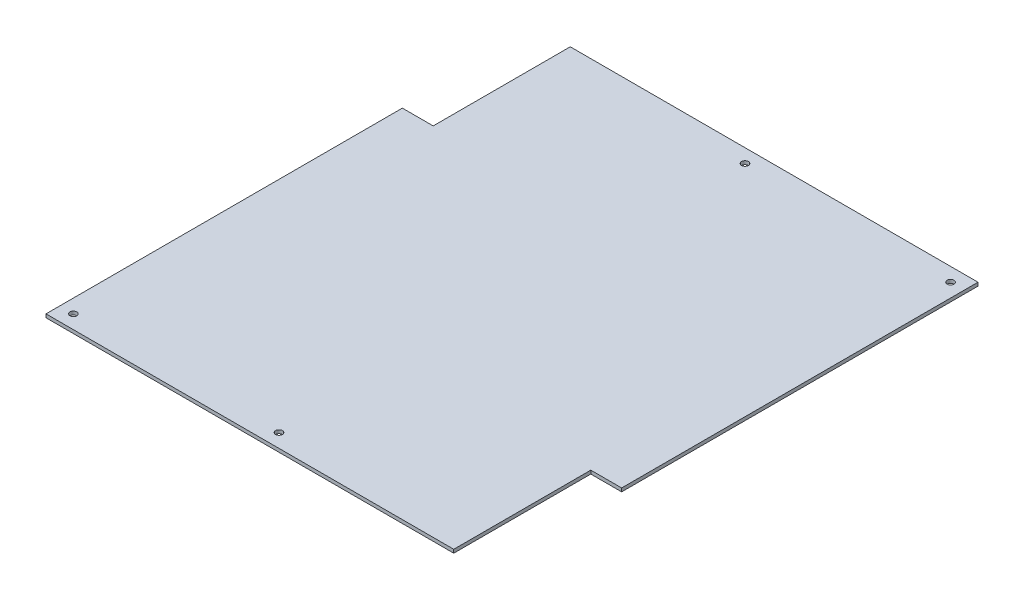
ISO-10303-21;
HEADER;
FILE_DESCRIPTION(('STEP AP214'),'2;1');
FILE_NAME('part.step','',(''),(''),'','','');
FILE_SCHEMA(('AUTOMOTIVE_DESIGN { 1 0 10303 214 1 1 1 1 }'));
ENDSEC;
DATA;
#1=APPLICATION_CONTEXT('core data for automotive mechanical design processes');
#2=APPLICATION_PROTOCOL_DEFINITION('international standard','automotive_design',2000,#1);
#3=PRODUCT_CONTEXT('',#1,'mechanical');
#4=PRODUCT('Part','Part','',(#3));
#5=PRODUCT_RELATED_PRODUCT_CATEGORY('part','',(#4));
#6=PRODUCT_DEFINITION_FORMATION('','',#4);
#7=PRODUCT_DEFINITION_CONTEXT('part definition',#1,'design');
#8=PRODUCT_DEFINITION('design','',#6,#7);
#9=PRODUCT_DEFINITION_SHAPE('','',#8);
#10=(LENGTH_UNIT() NAMED_UNIT(*) SI_UNIT(.MILLI.,.METRE.));
#11=(NAMED_UNIT(*) PLANE_ANGLE_UNIT() SI_UNIT($,.RADIAN.));
#12=(NAMED_UNIT(*) SI_UNIT($,.STERADIAN.) SOLID_ANGLE_UNIT());
#13=UNCERTAINTY_MEASURE_WITH_UNIT(LENGTH_MEASURE(1.E-05),#10,'distance_accuracy_value','');
#14=(GEOMETRIC_REPRESENTATION_CONTEXT(3) GLOBAL_UNCERTAINTY_ASSIGNED_CONTEXT((#13)) GLOBAL_UNIT_ASSIGNED_CONTEXT((#10,
#11,#12)) REPRESENTATION_CONTEXT('',''));
#15=CARTESIAN_POINT('',(0.,0.,0.));
#16=DIRECTION('',(0.,0.,1.));
#17=DIRECTION('',(1.,0.,0.));
#18=AXIS2_PLACEMENT_3D('',#15,#16,#17);
#19=CARTESIAN_POINT('',(-203.2,3.175,228.6));
#20=DIRECTION('',(1.,0.,0.));
#21=DIRECTION('',(0.,0.,-1.));
#22=AXIS2_PLACEMENT_3D('',#19,#20,#21);
#23=PLANE('',#22);
#24=DIRECTION('',(0.,0.,1.));
#25=VECTOR('',#24,1.);
#26=CARTESIAN_POINT('',(-203.2,3.175,228.6));
#27=LINE('',#26,#25);
#28=CARTESIAN_POINT('',(-203.2,3.175,-101.6));
#29=VERTEX_POINT('',#28);
#30=CARTESIAN_POINT('',(-203.2,3.175,228.6));
#31=VERTEX_POINT('',#30);
#32=EDGE_CURVE('E114',#29,#31,#27,.T.);
#33=ORIENTED_EDGE('',*,*,#32,.F.);
#34=DIRECTION('',(0.,1.,0.));
#35=VECTOR('',#34,1.);
#36=CARTESIAN_POINT('',(-203.2,-0.00100000000000013,-101.6));
#37=LINE('',#36,#35);
#38=CARTESIAN_POINT('',(-203.2,0.,-101.6));
#39=VERTEX_POINT('',#38);
#40=EDGE_CURVE('E102',#39,#29,#37,.T.);
#41=ORIENTED_EDGE('',*,*,#40,.F.);
#42=DIRECTION('',(0.,0.,1.));
#43=VECTOR('',#42,1.);
#44=CARTESIAN_POINT('',(-203.2,0.,228.6));
#45=LINE('',#44,#43);
#46=CARTESIAN_POINT('',(-203.2,0.,228.6));
#47=VERTEX_POINT('',#46);
#48=EDGE_CURVE('E107',#39,#47,#45,.T.);
#49=ORIENTED_EDGE('',*,*,#48,.T.);
#50=DIRECTION('',(0.,-1.,0.));
#51=VECTOR('',#50,1.);
#52=CARTESIAN_POINT('',(-203.2,3.175,228.6));
#53=LINE('',#52,#51);
#54=EDGE_CURVE('E11',#31,#47,#53,.T.);
#55=ORIENTED_EDGE('',*,*,#54,.F.);
#56=EDGE_LOOP('',(#33,#41,#49,#55));
#57=FACE_BOUND('',#56,.T.);
#58=ADVANCED_FACE('F35',(#57),#23,.F.);
#59=CARTESIAN_POINT('',(203.2,3.175,228.6));
#60=DIRECTION('',(0.,0.,-1.));
#61=DIRECTION('',(-1.,0.,0.));
#62=AXIS2_PLACEMENT_3D('',#59,#60,#61);
#63=PLANE('',#62);
#64=DIRECTION('',(1.,0.,0.));
#65=VECTOR('',#64,1.);
#66=CARTESIAN_POINT('',(203.2,0.,228.6));
#67=LINE('',#66,#65);
#68=CARTESIAN_POINT('',(174.625,0.,228.6));
#69=VERTEX_POINT('',#68);
#70=EDGE_CURVE('E119',#47,#69,#67,.T.);
#71=ORIENTED_EDGE('',*,*,#70,.T.);
#72=DIRECTION('',(0.,1.,0.));
#73=VECTOR('',#72,1.);
#74=CARTESIAN_POINT('',(174.625,-0.00100000000000013,228.6));
#75=LINE('',#74,#73);
#76=CARTESIAN_POINT('',(174.625,3.175,228.6));
#77=VERTEX_POINT('',#76);
#78=EDGE_CURVE('E148',#69,#77,#75,.T.);
#79=ORIENTED_EDGE('',*,*,#78,.T.);
#80=DIRECTION('',(1.,0.,0.));
#81=VECTOR('',#80,1.);
#82=CARTESIAN_POINT('',(203.2,3.175,228.6));
#83=LINE('',#82,#81);
#84=EDGE_CURVE('E139',#31,#77,#83,.T.);
#85=ORIENTED_EDGE('',*,*,#84,.F.);
#86=ORIENTED_EDGE('',*,*,#54,.T.);
#87=EDGE_LOOP('',(#71,#79,#85,#86));
#88=FACE_BOUND('',#87,.T.);
#89=ADVANCED_FACE('F217',(#88),#63,.F.);
#90=CARTESIAN_POINT('',(203.2,3.175,228.6));
#91=DIRECTION('',(-1.,0.,0.));
#92=DIRECTION('',(0.,0.,1.));
#93=AXIS2_PLACEMENT_3D('',#90,#91,#92);
#94=PLANE('',#93);
#95=DIRECTION('',(0.,0.,-1.));
#96=VECTOR('',#95,1.);
#97=CARTESIAN_POINT('',(203.2,3.175,228.6));
#98=LINE('',#97,#96);
#99=CARTESIAN_POINT('',(203.2,3.175,101.6));
#100=VERTEX_POINT('',#99);
#101=CARTESIAN_POINT('',(203.2,3.175,-228.6));
#102=VERTEX_POINT('',#101);
#103=EDGE_CURVE('E136',#100,#102,#98,.T.);
#104=ORIENTED_EDGE('',*,*,#103,.F.);
#105=DIRECTION('',(0.,1.,0.));
#106=VECTOR('',#105,1.);
#107=CARTESIAN_POINT('',(203.2,-0.00100000000000013,101.6));
#108=LINE('',#107,#106);
#109=CARTESIAN_POINT('',(203.2,0.,101.6));
#110=VERTEX_POINT('',#109);
#111=EDGE_CURVE('E149',#110,#100,#108,.T.);
#112=ORIENTED_EDGE('',*,*,#111,.F.);
#113=DIRECTION('',(0.,0.,-1.));
#114=VECTOR('',#113,1.);
#115=CARTESIAN_POINT('',(203.2,0.,228.6));
#116=LINE('',#115,#114);
#117=CARTESIAN_POINT('',(203.2,0.,-228.6));
#118=VERTEX_POINT('',#117);
#119=EDGE_CURVE('E121',#110,#118,#116,.T.);
#120=ORIENTED_EDGE('',*,*,#119,.T.);
#121=DIRECTION('',(0.,-1.,0.));
#122=VECTOR('',#121,1.);
#123=CARTESIAN_POINT('',(203.2,3.175,-228.6));
#124=LINE('',#123,#122);
#125=EDGE_CURVE('E42',#102,#118,#124,.T.);
#126=ORIENTED_EDGE('',*,*,#125,.F.);
#127=EDGE_LOOP('',(#104,#112,#120,#126));
#128=FACE_BOUND('',#127,.T.);
#129=ADVANCED_FACE('F210',(#128),#94,.F.);
#130=CARTESIAN_POINT('',(203.2,3.175,-228.6));
#131=DIRECTION('',(0.,0.,1.));
#132=DIRECTION('',(1.,0.,0.));
#133=AXIS2_PLACEMENT_3D('',#130,#131,#132);
#134=PLANE('',#133);
#135=DIRECTION('',(-1.,0.,0.));
#136=VECTOR('',#135,1.);
#137=CARTESIAN_POINT('',(203.2,0.,-228.6));
#138=LINE('',#137,#136);
#139=CARTESIAN_POINT('',(-174.625,0.,-228.6));
#140=VERTEX_POINT('',#139);
#141=EDGE_CURVE('E128',#118,#140,#138,.T.);
#142=ORIENTED_EDGE('',*,*,#141,.T.);
#143=DIRECTION('',(0.,1.,0.));
#144=VECTOR('',#143,1.);
#145=CARTESIAN_POINT('',(-174.625,-0.00100000000000013,-228.6));
#146=LINE('',#145,#144);
#147=CARTESIAN_POINT('',(-174.625,3.175,-228.6));
#148=VERTEX_POINT('',#147);
#149=EDGE_CURVE('E108',#140,#148,#146,.T.);
#150=ORIENTED_EDGE('',*,*,#149,.T.);
#151=DIRECTION('',(-1.,0.,0.));
#152=VECTOR('',#151,1.);
#153=CARTESIAN_POINT('',(203.2,3.175,-228.6));
#154=LINE('',#153,#152);
#155=EDGE_CURVE('E124',#102,#148,#154,.T.);
#156=ORIENTED_EDGE('',*,*,#155,.F.);
#157=ORIENTED_EDGE('',*,*,#125,.T.);
#158=EDGE_LOOP('',(#142,#150,#156,#157));
#159=FACE_BOUND('',#158,.T.);
#160=ADVANCED_FACE('F198',(#159),#134,.F.);
#161=CARTESIAN_POINT('',(0.,3.175,0.));
#162=DIRECTION('',(0.,1.,0.));
#163=DIRECTION('',(0.,0.,1.));
#164=AXIS2_PLACEMENT_3D('',#161,#162,#163);
#165=PLANE('',#164);
#166=CARTESIAN_POINT('',(-190.5,3.175,215.9));
#167=DIRECTION('',(0.,1.,0.));
#168=DIRECTION('',(0.,0.,1.));
#169=AXIS2_PLACEMENT_3D('',#166,#167,#168);
#170=CIRCLE('',#169,3.17500000000001);
#171=CARTESIAN_POINT('',(-190.5,3.175,219.075));
#172=VERTEX_POINT('',#171);
#173=EDGE_CURVE('E189',#172,#172,#170,.T.);
#174=ORIENTED_EDGE('',*,*,#173,.F.);
#175=EDGE_LOOP('',(#174));
#176=FACE_BOUND('',#175,.T.);
#177=CARTESIAN_POINT('',(190.5,3.175,-215.9));
#178=DIRECTION('',(0.,1.,0.));
#179=DIRECTION('',(0.,0.,1.));
#180=AXIS2_PLACEMENT_3D('',#177,#178,#179);
#181=CIRCLE('',#180,3.17500000000001);
#182=CARTESIAN_POINT('',(190.5,3.175,-212.725));
#183=VERTEX_POINT('',#182);
#184=EDGE_CURVE('E183',#183,#183,#181,.T.);
#185=ORIENTED_EDGE('',*,*,#184,.F.);
#186=EDGE_LOOP('',(#185));
#187=FACE_BOUND('',#186,.T.);
#188=CARTESIAN_POINT('',(0.,3.175,-215.9));
#189=DIRECTION('',(0.,1.,0.));
#190=DIRECTION('',(0.,0.,1.));
#191=AXIS2_PLACEMENT_3D('',#188,#189,#190);
#192=CIRCLE('',#191,3.175);
#193=CARTESIAN_POINT('',(0.,3.175,-212.725));
#194=VERTEX_POINT('',#193);
#195=EDGE_CURVE('E177',#194,#194,#192,.T.);
#196=ORIENTED_EDGE('',*,*,#195,.F.);
#197=EDGE_LOOP('',(#196));
#198=FACE_BOUND('',#197,.T.);
#199=CARTESIAN_POINT('',(0.,3.175,215.9));
#200=DIRECTION('',(0.,1.,0.));
#201=DIRECTION('',(0.,0.,1.));
#202=AXIS2_PLACEMENT_3D('',#199,#200,#201);
#203=CIRCLE('',#202,3.175);
#204=CARTESIAN_POINT('',(0.,3.175,219.075));
#205=VERTEX_POINT('',#204);
#206=EDGE_CURVE('E171',#205,#205,#203,.T.);
#207=ORIENTED_EDGE('',*,*,#206,.F.);
#208=EDGE_LOOP('',(#207));
#209=FACE_BOUND('',#208,.T.);
#210=DIRECTION('',(0.,0.,-1.));
#211=VECTOR('',#210,1.);
#212=CARTESIAN_POINT('',(-174.625,3.175,-228.6));
#213=LINE('',#212,#211);
#214=CARTESIAN_POINT('',(-174.625,3.175,-101.6));
#215=VERTEX_POINT('',#214);
#216=EDGE_CURVE('E115',#215,#148,#213,.T.);
#217=ORIENTED_EDGE('',*,*,#216,.F.);
#218=DIRECTION('',(1.,0.,0.));
#219=VECTOR('',#218,1.);
#220=CARTESIAN_POINT('',(-203.2,3.175,-101.6));
#221=LINE('',#220,#219);
#222=EDGE_CURVE('E166',#29,#215,#221,.T.);
#223=ORIENTED_EDGE('',*,*,#222,.F.);
#224=ORIENTED_EDGE('',*,*,#32,.T.);
#225=ORIENTED_EDGE('',*,*,#84,.T.);
#226=DIRECTION('',(0.,0.,1.));
#227=VECTOR('',#226,1.);
#228=CARTESIAN_POINT('',(174.625,3.175,228.6));
#229=LINE('',#228,#227);
#230=CARTESIAN_POINT('',(174.625,3.175,101.6));
#231=VERTEX_POINT('',#230);
#232=EDGE_CURVE('E152',#231,#77,#229,.T.);
#233=ORIENTED_EDGE('',*,*,#232,.F.);
#234=DIRECTION('',(-1.,0.,0.));
#235=VECTOR('',#234,1.);
#236=CARTESIAN_POINT('',(203.2,3.175,101.6));
#237=LINE('',#236,#235);
#238=EDGE_CURVE('E157',#100,#231,#237,.T.);
#239=ORIENTED_EDGE('',*,*,#238,.F.);
#240=ORIENTED_EDGE('',*,*,#103,.T.);
#241=ORIENTED_EDGE('',*,*,#155,.T.);
#242=EDGE_LOOP('',(#217,#223,#224,#225,#233,#239,#240,#241));
#243=FACE_BOUND('',#242,.T.);
#244=ADVANCED_FACE('F195',(#176,#187,#198,#209,#243),#165,.T.);
#245=CARTESIAN_POINT('',(0.,0.,0.));
#246=DIRECTION('',(0.,1.,0.));
#247=DIRECTION('',(0.,0.,1.));
#248=AXIS2_PLACEMENT_3D('',#245,#246,#247);
#249=PLANE('',#248);
#250=CARTESIAN_POINT('',(-190.5,0.,215.9));
#251=DIRECTION('',(0.,1.,0.));
#252=DIRECTION('',(0.,0.,1.));
#253=AXIS2_PLACEMENT_3D('',#250,#251,#252);
#254=CIRCLE('',#253,3.17500000000001);
#255=CARTESIAN_POINT('',(-190.5,0.,219.075));
#256=VERTEX_POINT('',#255);
#257=EDGE_CURVE('E186',#256,#256,#254,.T.);
#258=ORIENTED_EDGE('',*,*,#257,.T.);
#259=EDGE_LOOP('',(#258));
#260=FACE_BOUND('',#259,.T.);
#261=CARTESIAN_POINT('',(190.5,0.,-215.9));
#262=DIRECTION('',(0.,1.,0.));
#263=DIRECTION('',(0.,0.,1.));
#264=AXIS2_PLACEMENT_3D('',#261,#262,#263);
#265=CIRCLE('',#264,3.17500000000001);
#266=CARTESIAN_POINT('',(190.5,0.,-212.725));
#267=VERTEX_POINT('',#266);
#268=EDGE_CURVE('E180',#267,#267,#265,.T.);
#269=ORIENTED_EDGE('',*,*,#268,.T.);
#270=EDGE_LOOP('',(#269));
#271=FACE_BOUND('',#270,.T.);
#272=CARTESIAN_POINT('',(0.,0.,-215.9));
#273=DIRECTION('',(0.,1.,0.));
#274=DIRECTION('',(0.,0.,1.));
#275=AXIS2_PLACEMENT_3D('',#272,#273,#274);
#276=CIRCLE('',#275,3.175);
#277=CARTESIAN_POINT('',(0.,0.,-212.725));
#278=VERTEX_POINT('',#277);
#279=EDGE_CURVE('E174',#278,#278,#276,.T.);
#280=ORIENTED_EDGE('',*,*,#279,.T.);
#281=EDGE_LOOP('',(#280));
#282=FACE_BOUND('',#281,.T.);
#283=CARTESIAN_POINT('',(0.,0.,215.9));
#284=DIRECTION('',(0.,1.,0.));
#285=DIRECTION('',(0.,0.,1.));
#286=AXIS2_PLACEMENT_3D('',#283,#284,#285);
#287=CIRCLE('',#286,3.175);
#288=CARTESIAN_POINT('',(0.,0.,219.075));
#289=VERTEX_POINT('',#288);
#290=EDGE_CURVE('E160',#289,#289,#287,.T.);
#291=ORIENTED_EDGE('',*,*,#290,.T.);
#292=EDGE_LOOP('',(#291));
#293=FACE_BOUND('',#292,.T.);
#294=DIRECTION('',(-1.,0.,0.));
#295=VECTOR('',#294,1.);
#296=CARTESIAN_POINT('',(-203.2,0.,-101.6));
#297=LINE('',#296,#295);
#298=CARTESIAN_POINT('',(-174.625,0.,-101.6));
#299=VERTEX_POINT('',#298);
#300=EDGE_CURVE('E98',#299,#39,#297,.T.);
#301=ORIENTED_EDGE('',*,*,#300,.F.);
#302=DIRECTION('',(0.,0.,1.));
#303=VECTOR('',#302,1.);
#304=CARTESIAN_POINT('',(-174.625,0.,-228.6));
#305=LINE('',#304,#303);
#306=EDGE_CURVE('E49',#140,#299,#305,.T.);
#307=ORIENTED_EDGE('',*,*,#306,.F.);
#308=ORIENTED_EDGE('',*,*,#141,.F.);
#309=ORIENTED_EDGE('',*,*,#119,.F.);
#310=DIRECTION('',(1.,0.,0.));
#311=VECTOR('',#310,1.);
#312=CARTESIAN_POINT('',(203.2,0.,101.6));
#313=LINE('',#312,#311);
#314=CARTESIAN_POINT('',(174.625,0.,101.6));
#315=VERTEX_POINT('',#314);
#316=EDGE_CURVE('E146',#315,#110,#313,.T.);
#317=ORIENTED_EDGE('',*,*,#316,.F.);
#318=DIRECTION('',(0.,0.,-1.));
#319=VECTOR('',#318,1.);
#320=CARTESIAN_POINT('',(174.625,0.,228.6));
#321=LINE('',#320,#319);
#322=EDGE_CURVE('E57',#69,#315,#321,.T.);
#323=ORIENTED_EDGE('',*,*,#322,.F.);
#324=ORIENTED_EDGE('',*,*,#70,.F.);
#325=ORIENTED_EDGE('',*,*,#48,.F.);
#326=EDGE_LOOP('',(#301,#307,#308,#309,#317,#323,#324,#325));
#327=FACE_BOUND('',#326,.T.);
#328=ADVANCED_FACE('F117',(#260,#271,#282,#293,#327),#249,.F.);
#329=CARTESIAN_POINT('',(174.625,-0.00100000000000013,228.6));
#330=DIRECTION('',(-1.,0.,0.));
#331=DIRECTION('',(0.,0.,1.));
#332=AXIS2_PLACEMENT_3D('',#329,#330,#331);
#333=PLANE('',#332);
#334=ORIENTED_EDGE('',*,*,#322,.T.);
#335=DIRECTION('',(0.,1.,0.));
#336=VECTOR('',#335,1.);
#337=CARTESIAN_POINT('',(174.625,-0.00100000000000013,101.6));
#338=LINE('',#337,#336);
#339=EDGE_CURVE('E151',#315,#231,#338,.T.);
#340=ORIENTED_EDGE('',*,*,#339,.T.);
#341=ORIENTED_EDGE('',*,*,#232,.T.);
#342=ORIENTED_EDGE('',*,*,#78,.F.);
#343=EDGE_LOOP('',(#334,#340,#341,#342));
#344=FACE_BOUND('',#343,.T.);
#345=ADVANCED_FACE('F215',(#344),#333,.F.);
#346=CARTESIAN_POINT('',(203.2,-0.00100000000000013,101.6));
#347=DIRECTION('',(0.,0.,-1.));
#348=DIRECTION('',(-1.,0.,0.));
#349=AXIS2_PLACEMENT_3D('',#346,#347,#348);
#350=PLANE('',#349);
#351=ORIENTED_EDGE('',*,*,#316,.T.);
#352=ORIENTED_EDGE('',*,*,#111,.T.);
#353=ORIENTED_EDGE('',*,*,#238,.T.);
#354=ORIENTED_EDGE('',*,*,#339,.F.);
#355=EDGE_LOOP('',(#351,#352,#353,#354));
#356=FACE_BOUND('',#355,.T.);
#357=ADVANCED_FACE('F212',(#356),#350,.F.);
#358=CARTESIAN_POINT('',(-174.625,-0.00100000000000013,-228.6));
#359=DIRECTION('',(1.,0.,0.));
#360=DIRECTION('',(0.,0.,-1.));
#361=AXIS2_PLACEMENT_3D('',#358,#359,#360);
#362=PLANE('',#361);
#363=ORIENTED_EDGE('',*,*,#306,.T.);
#364=DIRECTION('',(0.,1.,0.));
#365=VECTOR('',#364,1.);
#366=CARTESIAN_POINT('',(-174.625,-0.00100000000000013,-101.6));
#367=LINE('',#366,#365);
#368=EDGE_CURVE('E104',#299,#215,#367,.T.);
#369=ORIENTED_EDGE('',*,*,#368,.T.);
#370=ORIENTED_EDGE('',*,*,#216,.T.);
#371=ORIENTED_EDGE('',*,*,#149,.F.);
#372=EDGE_LOOP('',(#363,#369,#370,#371));
#373=FACE_BOUND('',#372,.T.);
#374=ADVANCED_FACE('F205',(#373),#362,.F.);
#375=CARTESIAN_POINT('',(-203.2,-0.00100000000000013,-101.6));
#376=DIRECTION('',(0.,0.,1.));
#377=DIRECTION('',(1.,0.,0.));
#378=AXIS2_PLACEMENT_3D('',#375,#376,#377);
#379=PLANE('',#378);
#380=ORIENTED_EDGE('',*,*,#300,.T.);
#381=ORIENTED_EDGE('',*,*,#40,.T.);
#382=ORIENTED_EDGE('',*,*,#222,.T.);
#383=ORIENTED_EDGE('',*,*,#368,.F.);
#384=EDGE_LOOP('',(#380,#381,#382,#383));
#385=FACE_BOUND('',#384,.T.);
#386=ADVANCED_FACE('F100',(#385),#379,.F.);
#387=CARTESIAN_POINT('',(0.,3.175,215.9));
#388=DIRECTION('',(0.,1.,0.));
#389=DIRECTION('',(0.,0.,1.));
#390=AXIS2_PLACEMENT_3D('',#387,#388,#389);
#391=CYLINDRICAL_SURFACE('',#390,3.175);
#392=ORIENTED_EDGE('',*,*,#290,.F.);
#393=EDGE_LOOP('',(#392));
#394=FACE_BOUND('',#393,.T.);
#395=ORIENTED_EDGE('',*,*,#206,.T.);
#396=EDGE_LOOP('',(#395));
#397=FACE_BOUND('',#396,.T.);
#398=ADVANCED_FACE('F236',(#394,#397),#391,.F.);
#399=CARTESIAN_POINT('',(0.,3.175,-215.9));
#400=DIRECTION('',(0.,1.,0.));
#401=DIRECTION('',(0.,0.,1.));
#402=AXIS2_PLACEMENT_3D('',#399,#400,#401);
#403=CYLINDRICAL_SURFACE('',#402,3.175);
#404=ORIENTED_EDGE('',*,*,#279,.F.);
#405=EDGE_LOOP('',(#404));
#406=FACE_BOUND('',#405,.T.);
#407=ORIENTED_EDGE('',*,*,#195,.T.);
#408=EDGE_LOOP('',(#407));
#409=FACE_BOUND('',#408,.T.);
#410=ADVANCED_FACE('F241',(#406,#409),#403,.F.);
#411=CARTESIAN_POINT('',(190.5,3.175,-215.9));
#412=DIRECTION('',(0.,1.,0.));
#413=DIRECTION('',(0.,0.,1.));
#414=AXIS2_PLACEMENT_3D('',#411,#412,#413);
#415=CYLINDRICAL_SURFACE('',#414,3.17500000000001);
#416=ORIENTED_EDGE('',*,*,#268,.F.);
#417=EDGE_LOOP('',(#416));
#418=FACE_BOUND('',#417,.T.);
#419=ORIENTED_EDGE('',*,*,#184,.T.);
#420=EDGE_LOOP('',(#419));
#421=FACE_BOUND('',#420,.T.);
#422=ADVANCED_FACE('F245',(#418,#421),#415,.F.);
#423=CARTESIAN_POINT('',(-190.5,3.175,215.9));
#424=DIRECTION('',(0.,1.,0.));
#425=DIRECTION('',(0.,0.,1.));
#426=AXIS2_PLACEMENT_3D('',#423,#424,#425);
#427=CYLINDRICAL_SURFACE('',#426,3.17500000000001);
#428=ORIENTED_EDGE('',*,*,#257,.F.);
#429=EDGE_LOOP('',(#428));
#430=FACE_BOUND('',#429,.T.);
#431=ORIENTED_EDGE('',*,*,#173,.T.);
#432=EDGE_LOOP('',(#431));
#433=FACE_BOUND('',#432,.T.);
#434=ADVANCED_FACE('F193',(#430,#433),#427,.F.);
#435=CLOSED_SHELL('',(#58,#89,#129,#160,#244,#328,#345,#357,#374,#386,#398,#410,#422,#434));
#436=MANIFOLD_SOLID_BREP('B2',#435);
#437=ADVANCED_BREP_SHAPE_REPRESENTATION('',(#18,#436),#14);
#438=SHAPE_DEFINITION_REPRESENTATION(#9,#437);
ENDSEC;
END-ISO-10303-21;
